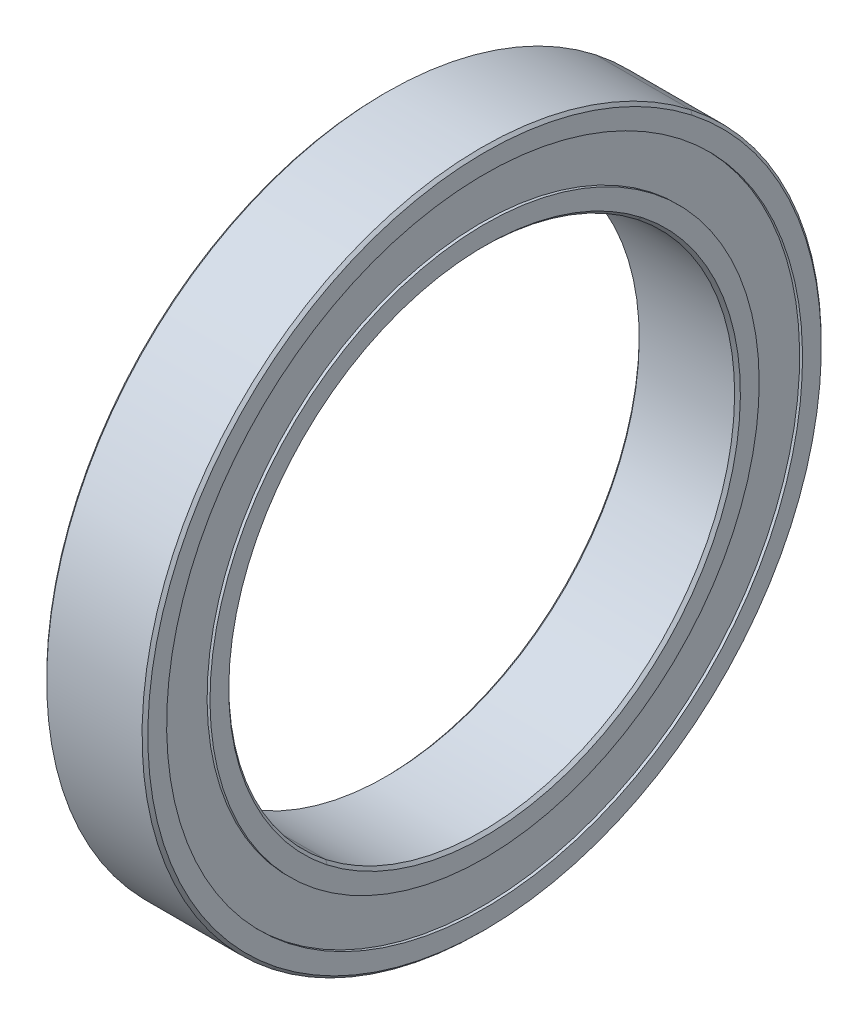
ISO-10303-21;
HEADER;
FILE_DESCRIPTION(('STEP AP214'),'2;1');
FILE_NAME('part.step','',(''),(''),'','','');
FILE_SCHEMA(('AUTOMOTIVE_DESIGN { 1 0 10303 214 1 1 1 1 }'));
ENDSEC;
DATA;
#1=APPLICATION_CONTEXT('core data for automotive mechanical design processes');
#2=APPLICATION_PROTOCOL_DEFINITION('international standard','automotive_design',2000,#1);
#3=PRODUCT_CONTEXT('',#1,'mechanical');
#4=PRODUCT('Part','Part','',(#3));
#5=PRODUCT_RELATED_PRODUCT_CATEGORY('part','',(#4));
#6=PRODUCT_DEFINITION_FORMATION('','',#4);
#7=PRODUCT_DEFINITION_CONTEXT('part definition',#1,'design');
#8=PRODUCT_DEFINITION('design','',#6,#7);
#9=PRODUCT_DEFINITION_SHAPE('','',#8);
#10=(LENGTH_UNIT() NAMED_UNIT(*) SI_UNIT(.MILLI.,.METRE.));
#11=(NAMED_UNIT(*) PLANE_ANGLE_UNIT() SI_UNIT($,.RADIAN.));
#12=(NAMED_UNIT(*) SI_UNIT($,.STERADIAN.) SOLID_ANGLE_UNIT());
#13=UNCERTAINTY_MEASURE_WITH_UNIT(LENGTH_MEASURE(1.E-05),#10,'distance_accuracy_value','');
#14=(GEOMETRIC_REPRESENTATION_CONTEXT(3) GLOBAL_UNCERTAINTY_ASSIGNED_CONTEXT((#13)) GLOBAL_UNIT_ASSIGNED_CONTEXT((#10,
#11,#12)) REPRESENTATION_CONTEXT('',''));
#15=CARTESIAN_POINT('',(0.,0.,0.));
#16=DIRECTION('',(0.,0.,1.));
#17=DIRECTION('',(1.,0.,0.));
#18=AXIS2_PLACEMENT_3D('',#15,#16,#17);
#19=CARTESIAN_POINT('',(85.025365407897,0.,20.5));
#20=DIRECTION('',(-1.,0.,0.));
#21=DIRECTION('',(0.,-0.787716900688965,0.616037405007985));
#22=AXIS2_PLACEMENT_3D('',#19,#20,#21);
#23=CONICAL_SURFACE('',#22,17.7,0.78539816339744);
#24=DIRECTION('',(-0.707106781186554,0.556999962132413,-0.435604226545706));
#25=VECTOR('',#24,1.);
#26=CARTESIAN_POINT('',(85.025365407897,13.9425891421947,9.59613793135867));
#27=LINE('',#26,#25);
#28=CARTESIAN_POINT('',(85.225365407897,13.7850457620569,9.71934541236027));
#29=VERTEX_POINT('',#28);
#30=CARTESIAN_POINT('',(85.025365407897,13.9425891421947,9.59613793135867));
#31=VERTEX_POINT('',#30);
#32=EDGE_CURVE('E302',#29,#31,#27,.T.);
#33=ORIENTED_EDGE('',*,*,#32,.F.);
#34=CARTESIAN_POINT('',(85.225365407897,0.,20.5));
#35=DIRECTION('',(-1.,0.,0.));
#36=DIRECTION('',(0.,0.787716900688965,-0.616037405007985));
#37=AXIS2_PLACEMENT_3D('',#34,#35,#36);
#38=CIRCLE('',#37,17.5);
#39=CARTESIAN_POINT('',(85.225365407897,-13.7850457620569,31.2806545876397));
#40=VERTEX_POINT('',#39);
#41=EDGE_CURVE('E174',#40,#29,#38,.T.);
#42=ORIENTED_EDGE('',*,*,#41,.F.);
#43=DIRECTION('',(-0.707106781186554,-0.556999962132413,0.435604226545706));
#44=VECTOR('',#43,1.);
#45=CARTESIAN_POINT('',(85.025365407897,-13.9425891421947,31.4038620686413));
#46=LINE('',#45,#44);
#47=CARTESIAN_POINT('',(85.025365407897,-13.9425891421947,31.4038620686413));
#48=VERTEX_POINT('',#47);
#49=EDGE_CURVE('E311',#40,#48,#46,.T.);
#50=ORIENTED_EDGE('',*,*,#49,.T.);
#51=CARTESIAN_POINT('',(85.025365407897,0.,20.5));
#52=DIRECTION('',(1.,0.,0.));
#53=DIRECTION('',(0.,0.787716900688965,-0.616037405007985));
#54=AXIS2_PLACEMENT_3D('',#51,#52,#53);
#55=CIRCLE('',#54,17.7);
#56=EDGE_CURVE('E221',#31,#48,#55,.T.);
#57=ORIENTED_EDGE('',*,*,#56,.F.);
#58=EDGE_LOOP('',(#33,#42,#50,#57));
#59=FACE_BOUND('',#58,.T.);
#60=ADVANCED_FACE('F50',(#59),#23,.F.);
#61=CARTESIAN_POINT('',(91.825365407897,0.,20.5));
#62=DIRECTION('',(1.,0.,0.));
#63=DIRECTION('',(0.,0.787716900688965,-0.616037405007985));
#64=AXIS2_PLACEMENT_3D('',#61,#62,#63);
#65=CONICAL_SURFACE('',#64,17.5,0.785398163397457);
#66=DIRECTION('',(0.707106781186542,-0.556999962132422,0.435604226545714));
#67=VECTOR('',#66,1.);
#68=CARTESIAN_POINT('',(91.825365407897,-13.7850457620569,31.2806545876397));
#69=LINE('',#68,#67);
#70=CARTESIAN_POINT('',(91.825365407897,-13.7850457620569,31.2806545876397));
#71=VERTEX_POINT('',#70);
#72=CARTESIAN_POINT('',(92.025365407897,-13.9425891421947,31.4038620686413));
#73=VERTEX_POINT('',#72);
#74=EDGE_CURVE('E310',#71,#73,#69,.T.);
#75=ORIENTED_EDGE('',*,*,#74,.F.);
#76=CARTESIAN_POINT('',(91.825365407897,0.,20.5));
#77=DIRECTION('',(1.,0.,0.));
#78=DIRECTION('',(0.,0.787716900688965,-0.616037405007985));
#79=AXIS2_PLACEMENT_3D('',#76,#77,#78);
#80=CIRCLE('',#79,17.5);
#81=CARTESIAN_POINT('',(91.825365407897,13.7850457620569,9.71934541236027));
#82=VERTEX_POINT('',#81);
#83=EDGE_CURVE('E242',#82,#71,#80,.T.);
#84=ORIENTED_EDGE('',*,*,#83,.F.);
#85=DIRECTION('',(0.707106781186542,0.556999962132422,-0.435604226545714));
#86=VECTOR('',#85,1.);
#87=CARTESIAN_POINT('',(91.825365407897,13.7850457620569,9.71934541236027));
#88=LINE('',#87,#86);
#89=CARTESIAN_POINT('',(92.025365407897,13.9425891421947,9.59613793135867));
#90=VERTEX_POINT('',#89);
#91=EDGE_CURVE('E327',#82,#90,#88,.T.);
#92=ORIENTED_EDGE('',*,*,#91,.T.);
#93=CARTESIAN_POINT('',(92.025365407897,0.,20.5));
#94=DIRECTION('',(-1.,0.,0.));
#95=DIRECTION('',(0.,0.787716900688965,-0.616037405007985));
#96=AXIS2_PLACEMENT_3D('',#93,#94,#95);
#97=CIRCLE('',#96,17.7);
#98=EDGE_CURVE('E228',#73,#90,#97,.T.);
#99=ORIENTED_EDGE('',*,*,#98,.F.);
#100=EDGE_LOOP('',(#75,#84,#92,#99));
#101=FACE_BOUND('',#100,.T.);
#102=ADVANCED_FACE('F402',(#101),#65,.F.);
#103=CARTESIAN_POINT('',(85.225365407897,0.,20.5));
#104=DIRECTION('',(1.,0.,0.));
#105=DIRECTION('',(0.,0.787716900688965,-0.616037405007985));
#106=AXIS2_PLACEMENT_3D('',#103,#104,#105);
#107=CONICAL_SURFACE('',#106,23.5,0.785398163397448);
#108=DIRECTION('',(0.707106781186548,-0.556999962132418,0.43560422654571));
#109=VECTOR('',#108,1.);
#110=CARTESIAN_POINT('',(85.225365407897,-18.5113471661907,34.9768790176876));
#111=LINE('',#110,#109);
#112=CARTESIAN_POINT('',(85.025365407897,-18.3538037860529,34.853671536686));
#113=VERTEX_POINT('',#112);
#114=CARTESIAN_POINT('',(85.225365407897,-18.5113471661907,34.9768790176876));
#115=VERTEX_POINT('',#114);
#116=EDGE_CURVE('E326',#113,#115,#111,.T.);
#117=ORIENTED_EDGE('',*,*,#116,.F.);
#118=CARTESIAN_POINT('',(85.025365407897,0.,20.5));
#119=DIRECTION('',(-1.,0.,0.));
#120=DIRECTION('',(0.,0.787716900688965,-0.616037405007985));
#121=AXIS2_PLACEMENT_3D('',#118,#119,#120);
#122=CIRCLE('',#121,23.3);
#123=CARTESIAN_POINT('',(85.025365407897,18.3538037860529,6.14632846331395));
#124=VERTEX_POINT('',#123);
#125=EDGE_CURVE('E238',#124,#113,#122,.T.);
#126=ORIENTED_EDGE('',*,*,#125,.F.);
#127=DIRECTION('',(0.707106781186548,0.556999962132418,-0.43560422654571));
#128=VECTOR('',#127,1.);
#129=CARTESIAN_POINT('',(85.225365407897,18.5113471661907,6.02312098231236));
#130=LINE('',#129,#128);
#131=CARTESIAN_POINT('',(85.225365407897,18.5113471661907,6.02312098231236));
#132=VERTEX_POINT('',#131);
#133=EDGE_CURVE('E348',#124,#132,#130,.T.);
#134=ORIENTED_EDGE('',*,*,#133,.T.);
#135=CARTESIAN_POINT('',(85.225365407897,0.,20.5));
#136=DIRECTION('',(1.,0.,0.));
#137=DIRECTION('',(0.,0.787716900688965,-0.616037405007985));
#138=AXIS2_PLACEMENT_3D('',#135,#136,#137);
#139=CIRCLE('',#138,23.5);
#140=EDGE_CURVE('E241',#115,#132,#139,.T.);
#141=ORIENTED_EDGE('',*,*,#140,.F.);
#142=EDGE_LOOP('',(#117,#126,#134,#141));
#143=FACE_BOUND('',#142,.T.);
#144=ADVANCED_FACE('F407',(#143),#107,.T.);
#145=CARTESIAN_POINT('',(92.025365407897,0.,20.5));
#146=DIRECTION('',(-1.,0.,0.));
#147=DIRECTION('',(0.,-0.787716900688965,0.616037405007985));
#148=AXIS2_PLACEMENT_3D('',#145,#146,#147);
#149=CONICAL_SURFACE('',#148,23.3,0.785398163397431);
#150=DIRECTION('',(-0.70710678118656,0.556999962132407,-0.435604226545702));
#151=VECTOR('',#150,1.);
#152=CARTESIAN_POINT('',(92.025365407897,18.3538037860529,6.14632846331396));
#153=LINE('',#152,#151);
#154=CARTESIAN_POINT('',(92.025365407897,18.3538037860529,6.14632846331396));
#155=VERTEX_POINT('',#154);
#156=CARTESIAN_POINT('',(91.825365407897,18.5113471661907,6.02312098231236));
#157=VERTEX_POINT('',#156);
#158=EDGE_CURVE('E335',#155,#157,#153,.T.);
#159=ORIENTED_EDGE('',*,*,#158,.F.);
#160=CARTESIAN_POINT('',(92.025365407897,0.,20.5));
#161=DIRECTION('',(1.,0.,0.));
#162=DIRECTION('',(0.,0.787716900688965,-0.616037405007985));
#163=AXIS2_PLACEMENT_3D('',#160,#161,#162);
#164=CIRCLE('',#163,23.3);
#165=CARTESIAN_POINT('',(92.025365407897,-18.3538037860529,34.853671536686));
#166=VERTEX_POINT('',#165);
#167=EDGE_CURVE('E229',#166,#155,#164,.T.);
#168=ORIENTED_EDGE('',*,*,#167,.F.);
#169=DIRECTION('',(-0.70710678118656,-0.556999962132407,0.435604226545702));
#170=VECTOR('',#169,1.);
#171=CARTESIAN_POINT('',(92.025365407897,-18.3538037860529,34.853671536686));
#172=LINE('',#171,#170);
#173=CARTESIAN_POINT('',(91.825365407897,-18.5113471661907,34.9768790176876));
#174=VERTEX_POINT('',#173);
#175=EDGE_CURVE('E364',#166,#174,#172,.T.);
#176=ORIENTED_EDGE('',*,*,#175,.T.);
#177=CARTESIAN_POINT('',(91.825365407897,0.,20.5));
#178=DIRECTION('',(-1.,0.,0.));
#179=DIRECTION('',(0.,0.787716900688965,-0.616037405007985));
#180=AXIS2_PLACEMENT_3D('',#177,#178,#179);
#181=CIRCLE('',#180,23.5);
#182=EDGE_CURVE('E237',#157,#174,#181,.T.);
#183=ORIENTED_EDGE('',*,*,#182,.F.);
#184=EDGE_LOOP('',(#159,#168,#176,#183));
#185=FACE_BOUND('',#184,.T.);
#186=ADVANCED_FACE('F399',(#185),#149,.T.);
#187=CARTESIAN_POINT('',(85.225365407897,0.,20.5));
#188=DIRECTION('',(-1.,0.,0.));
#189=DIRECTION('',(0.,-0.787716900688965,0.616037405007985));
#190=AXIS2_PLACEMENT_3D('',#187,#188,#189);
#191=CYLINDRICAL_SURFACE('',#190,19.);
#192=DIRECTION('',(-1.,0.,0.));
#193=VECTOR('',#192,1.);
#194=CARTESIAN_POINT('',(85.225365407897,14.9666211130903,8.79528930484829));
#195=LINE('',#194,#193);
#196=CARTESIAN_POINT('',(85.225365407897,14.9666211130903,8.79528930484829));
#197=VERTEX_POINT('',#196);
#198=CARTESIAN_POINT('',(85.025365407897,14.9666211130903,8.79528930484829));
#199=VERTEX_POINT('',#198);
#200=EDGE_CURVE('E372',#197,#199,#195,.T.);
#201=ORIENTED_EDGE('',*,*,#200,.F.);
#202=CARTESIAN_POINT('',(85.225365407897,0.,20.5));
#203=DIRECTION('',(-1.,0.,0.));
#204=DIRECTION('',(0.,-0.787716900688965,0.616037405007985));
#205=AXIS2_PLACEMENT_3D('',#202,#203,#204);
#206=CIRCLE('',#205,19.);
#207=CARTESIAN_POINT('',(85.225365407897,-14.9666211130903,32.2047106951517));
#208=VERTEX_POINT('',#207);
#209=EDGE_CURVE('E11',#197,#208,#206,.T.);
#210=ORIENTED_EDGE('',*,*,#209,.T.);
#211=DIRECTION('',(-1.,0.,0.));
#212=VECTOR('',#211,1.);
#213=CARTESIAN_POINT('',(85.225365407897,-14.9666211130903,32.2047106951517));
#214=LINE('',#213,#212);
#215=CARTESIAN_POINT('',(85.025365407897,-14.9666211130903,32.2047106951517));
#216=VERTEX_POINT('',#215);
#217=EDGE_CURVE('E269',#208,#216,#214,.T.);
#218=ORIENTED_EDGE('',*,*,#217,.T.);
#219=CARTESIAN_POINT('',(85.025365407897,0.,20.5));
#220=DIRECTION('',(-1.,0.,0.));
#221=DIRECTION('',(0.,-0.787716900688965,0.616037405007985));
#222=AXIS2_PLACEMENT_3D('',#219,#220,#221);
#223=CIRCLE('',#222,19.);
#224=EDGE_CURVE('E218',#199,#216,#223,.T.);
#225=ORIENTED_EDGE('',*,*,#224,.F.);
#226=EDGE_LOOP('',(#201,#210,#218,#225));
#227=FACE_BOUND('',#226,.T.);
#228=ADVANCED_FACE('F389',(#227),#191,.T.);
#229=CARTESIAN_POINT('',(85.225365407897,0.,20.5));
#230=DIRECTION('',(-1.,0.,0.));
#231=DIRECTION('',(0.,-0.787716900688965,0.616037405007985));
#232=AXIS2_PLACEMENT_3D('',#229,#230,#231);
#233=PLANE('',#232);
#234=CARTESIAN_POINT('',(85.225365407897,0.,20.5));
#235=DIRECTION('',(-1.,0.,0.));
#236=DIRECTION('',(0.,-0.787716900688965,0.616037405007985));
#237=AXIS2_PLACEMENT_3D('',#234,#235,#236);
#238=CIRCLE('',#237,19.);
#239=EDGE_CURVE('E368',#208,#197,#238,.T.);
#240=ORIENTED_EDGE('',*,*,#239,.F.);
#241=ORIENTED_EDGE('',*,*,#209,.F.);
#242=EDGE_LOOP('',(#240,#241));
#243=FACE_BOUND('',#242,.T.);
#244=CARTESIAN_POINT('',(85.225365407897,0.,20.5));
#245=DIRECTION('',(-1.,0.,0.));
#246=DIRECTION('',(0.,-0.787716900688965,0.616037405007985));
#247=AXIS2_PLACEMENT_3D('',#244,#245,#246);
#248=CIRCLE('',#247,22.);
#249=CARTESIAN_POINT('',(85.225365407897,-17.3297718151572,34.0528229101757));
#250=VERTEX_POINT('',#249);
#251=CARTESIAN_POINT('',(85.225365407897,17.3297718151572,6.94717708982434));
#252=VERTEX_POINT('',#251);
#253=EDGE_CURVE('E58',#250,#252,#248,.T.);
#254=ORIENTED_EDGE('',*,*,#253,.T.);
#255=CARTESIAN_POINT('',(85.225365407897,0.,20.5));
#256=DIRECTION('',(-1.,0.,0.));
#257=DIRECTION('',(0.,-0.787716900688965,0.616037405007985));
#258=AXIS2_PLACEMENT_3D('',#255,#256,#257);
#259=CIRCLE('',#258,22.);
#260=EDGE_CURVE('E253',#252,#250,#259,.T.);
#261=ORIENTED_EDGE('',*,*,#260,.T.);
#262=EDGE_LOOP('',(#254,#261));
#263=FACE_BOUND('',#262,.T.);
#264=ADVANCED_FACE('F251',(#243,#263),#233,.T.);
#265=CARTESIAN_POINT('',(85.225365407897,0.,20.5));
#266=DIRECTION('',(-1.,0.,0.));
#267=DIRECTION('',(0.,-0.787716900688965,0.616037405007985));
#268=AXIS2_PLACEMENT_3D('',#265,#266,#267);
#269=CYLINDRICAL_SURFACE('',#268,22.);
#270=DIRECTION('',(-1.,0.,0.));
#271=VECTOR('',#270,1.);
#272=CARTESIAN_POINT('',(85.225365407897,17.3297718151572,6.94717708982434));
#273=LINE('',#272,#271);
#274=CARTESIAN_POINT('',(85.025365407897,17.3297718151572,6.94717708982434));
#275=VERTEX_POINT('',#274);
#276=EDGE_CURVE('E258',#252,#275,#273,.T.);
#277=ORIENTED_EDGE('',*,*,#276,.F.);
#278=ORIENTED_EDGE('',*,*,#253,.F.);
#279=DIRECTION('',(-1.,0.,0.));
#280=VECTOR('',#279,1.);
#281=CARTESIAN_POINT('',(85.225365407897,-17.3297718151572,34.0528229101757));
#282=LINE('',#281,#280);
#283=CARTESIAN_POINT('',(85.025365407897,-17.3297718151572,34.0528229101757));
#284=VERTEX_POINT('',#283);
#285=EDGE_CURVE('E267',#250,#284,#282,.T.);
#286=ORIENTED_EDGE('',*,*,#285,.T.);
#287=CARTESIAN_POINT('',(85.025365407897,0.,20.5));
#288=DIRECTION('',(-1.,0.,0.));
#289=DIRECTION('',(0.,-0.787716900688965,0.616037405007985));
#290=AXIS2_PLACEMENT_3D('',#287,#288,#289);
#291=CIRCLE('',#290,22.);
#292=EDGE_CURVE('E233',#284,#275,#291,.T.);
#293=ORIENTED_EDGE('',*,*,#292,.T.);
#294=EDGE_LOOP('',(#277,#278,#286,#293));
#295=FACE_BOUND('',#294,.T.);
#296=ADVANCED_FACE('F259',(#295),#269,.F.);
#297=CARTESIAN_POINT('',(91.825365407897,0.,20.5));
#298=DIRECTION('',(1.,0.,0.));
#299=DIRECTION('',(0.,0.787716900688965,-0.616037405007985));
#300=AXIS2_PLACEMENT_3D('',#297,#298,#299);
#301=CYLINDRICAL_SURFACE('',#300,19.);
#302=DIRECTION('',(1.,0.,0.));
#303=VECTOR('',#302,1.);
#304=CARTESIAN_POINT('',(91.825365407897,-14.9666211130903,32.2047106951517));
#305=LINE('',#304,#303);
#306=CARTESIAN_POINT('',(91.825365407897,-14.9666211130903,32.2047106951517));
#307=VERTEX_POINT('',#306);
#308=CARTESIAN_POINT('',(92.025365407897,-14.9666211130903,32.2047106951517));
#309=VERTEX_POINT('',#308);
#310=EDGE_CURVE('E284',#307,#309,#305,.T.);
#311=ORIENTED_EDGE('',*,*,#310,.F.);
#312=CARTESIAN_POINT('',(91.825365407897,0.,20.5));
#313=DIRECTION('',(1.,0.,0.));
#314=DIRECTION('',(0.,0.787716900688965,-0.616037405007985));
#315=AXIS2_PLACEMENT_3D('',#312,#313,#314);
#316=CIRCLE('',#315,19.);
#317=CARTESIAN_POINT('',(91.825365407897,14.9666211130903,8.79528930484829));
#318=VERTEX_POINT('',#317);
#319=EDGE_CURVE('E173',#307,#318,#316,.T.);
#320=ORIENTED_EDGE('',*,*,#319,.T.);
#321=DIRECTION('',(1.,0.,0.));
#322=VECTOR('',#321,1.);
#323=CARTESIAN_POINT('',(91.825365407897,14.9666211130903,8.79528930484829));
#324=LINE('',#323,#322);
#325=CARTESIAN_POINT('',(92.025365407897,14.9666211130903,8.79528930484829));
#326=VERTEX_POINT('',#325);
#327=EDGE_CURVE('E187',#318,#326,#324,.T.);
#328=ORIENTED_EDGE('',*,*,#327,.T.);
#329=CARTESIAN_POINT('',(92.025365407897,0.,20.5));
#330=DIRECTION('',(1.,0.,0.));
#331=DIRECTION('',(0.,0.787716900688965,-0.616037405007985));
#332=AXIS2_PLACEMENT_3D('',#329,#330,#331);
#333=CIRCLE('',#332,19.);
#334=EDGE_CURVE('E225',#309,#326,#333,.T.);
#335=ORIENTED_EDGE('',*,*,#334,.F.);
#336=EDGE_LOOP('',(#311,#320,#328,#335));
#337=FACE_BOUND('',#336,.T.);
#338=ADVANCED_FACE('F397',(#337),#301,.T.);
#339=CARTESIAN_POINT('',(91.825365407897,0.,20.5));
#340=DIRECTION('',(1.,0.,0.));
#341=DIRECTION('',(0.,0.616037405007985,0.787716900688965));
#342=AXIS2_PLACEMENT_3D('',#339,#340,#341);
#343=PLANE('',#342);
#344=CARTESIAN_POINT('',(91.825365407897,0.,20.5));
#345=DIRECTION('',(1.,0.,0.));
#346=DIRECTION('',(0.,0.787716900688965,-0.616037405007985));
#347=AXIS2_PLACEMENT_3D('',#344,#345,#346);
#348=CIRCLE('',#347,19.);
#349=EDGE_CURVE('E281',#318,#307,#348,.T.);
#350=ORIENTED_EDGE('',*,*,#349,.F.);
#351=ORIENTED_EDGE('',*,*,#319,.F.);
#352=EDGE_LOOP('',(#350,#351));
#353=FACE_BOUND('',#352,.T.);
#354=CARTESIAN_POINT('',(91.825365407897,0.,20.5));
#355=DIRECTION('',(1.,0.,0.));
#356=DIRECTION('',(0.,0.787716900688965,-0.616037405007985));
#357=AXIS2_PLACEMENT_3D('',#354,#355,#356);
#358=CIRCLE('',#357,22.);
#359=CARTESIAN_POINT('',(91.825365407897,17.3297718151572,6.94717708982434));
#360=VERTEX_POINT('',#359);
#361=CARTESIAN_POINT('',(91.825365407897,-17.3297718151572,34.0528229101757));
#362=VERTEX_POINT('',#361);
#363=EDGE_CURVE('E167',#360,#362,#358,.T.);
#364=ORIENTED_EDGE('',*,*,#363,.T.);
#365=CARTESIAN_POINT('',(91.825365407897,0.,20.5));
#366=DIRECTION('',(1.,0.,0.));
#367=DIRECTION('',(0.,0.787716900688965,-0.616037405007985));
#368=AXIS2_PLACEMENT_3D('',#365,#366,#367);
#369=CIRCLE('',#368,22.);
#370=EDGE_CURVE('E170',#362,#360,#369,.T.);
#371=ORIENTED_EDGE('',*,*,#370,.T.);
#372=EDGE_LOOP('',(#364,#371));
#373=FACE_BOUND('',#372,.T.);
#374=ADVANCED_FACE('F168',(#353,#373),#343,.T.);
#375=CARTESIAN_POINT('',(91.825365407897,0.,20.5));
#376=DIRECTION('',(1.,0.,0.));
#377=DIRECTION('',(0.,0.787716900688965,-0.616037405007985));
#378=AXIS2_PLACEMENT_3D('',#375,#376,#377);
#379=CYLINDRICAL_SURFACE('',#378,22.);
#380=DIRECTION('',(1.,0.,0.));
#381=VECTOR('',#380,1.);
#382=CARTESIAN_POINT('',(91.825365407897,-17.3297718151572,34.0528229101757));
#383=LINE('',#382,#381);
#384=CARTESIAN_POINT('',(92.025365407897,-17.3297718151572,34.0528229101757));
#385=VERTEX_POINT('',#384);
#386=EDGE_CURVE('E177',#362,#385,#383,.T.);
#387=ORIENTED_EDGE('',*,*,#386,.F.);
#388=ORIENTED_EDGE('',*,*,#363,.F.);
#389=DIRECTION('',(1.,0.,0.));
#390=VECTOR('',#389,1.);
#391=CARTESIAN_POINT('',(91.825365407897,17.3297718151572,6.94717708982434));
#392=LINE('',#391,#390);
#393=CARTESIAN_POINT('',(92.025365407897,17.3297718151572,6.94717708982434));
#394=VERTEX_POINT('',#393);
#395=EDGE_CURVE('E185',#360,#394,#392,.T.);
#396=ORIENTED_EDGE('',*,*,#395,.T.);
#397=CARTESIAN_POINT('',(92.025365407897,0.,20.5));
#398=DIRECTION('',(1.,0.,0.));
#399=DIRECTION('',(0.,0.787716900688965,-0.616037405007985));
#400=AXIS2_PLACEMENT_3D('',#397,#398,#399);
#401=CIRCLE('',#400,22.);
#402=EDGE_CURVE('E67',#394,#385,#401,.T.);
#403=ORIENTED_EDGE('',*,*,#402,.T.);
#404=EDGE_LOOP('',(#387,#388,#396,#403));
#405=FACE_BOUND('',#404,.T.);
#406=ADVANCED_FACE('F178',(#405),#379,.F.);
#407=CARTESIAN_POINT('',(92.025365407897,0.,20.5));
#408=DIRECTION('',(-1.,0.,0.));
#409=DIRECTION('',(0.,-0.787716900688965,0.616037405007985));
#410=AXIS2_PLACEMENT_3D('',#407,#408,#409);
#411=CYLINDRICAL_SURFACE('',#410,17.5);
#412=DIRECTION('',(-1.,0.,0.));
#413=VECTOR('',#412,1.);
#414=CARTESIAN_POINT('',(92.025365407897,13.7850457620569,9.71934541236027));
#415=LINE('',#414,#413);
#416=EDGE_CURVE('E202',#82,#29,#415,.T.);
#417=ORIENTED_EDGE('',*,*,#416,.F.);
#418=ORIENTED_EDGE('',*,*,#83,.T.);
#419=DIRECTION('',(-1.,0.,0.));
#420=VECTOR('',#419,1.);
#421=CARTESIAN_POINT('',(92.025365407897,-13.7850457620569,31.2806545876397));
#422=LINE('',#421,#420);
#423=EDGE_CURVE('E206',#71,#40,#422,.T.);
#424=ORIENTED_EDGE('',*,*,#423,.T.);
#425=ORIENTED_EDGE('',*,*,#41,.T.);
#426=EDGE_LOOP('',(#417,#418,#424,#425));
#427=FACE_BOUND('',#426,.T.);
#428=ADVANCED_FACE('F444',(#427),#411,.F.);
#429=CARTESIAN_POINT('',(92.025365407897,0.,20.5));
#430=DIRECTION('',(-1.,0.,0.));
#431=DIRECTION('',(0.,-0.787716900688965,0.616037405007985));
#432=AXIS2_PLACEMENT_3D('',#429,#430,#431);
#433=CYLINDRICAL_SURFACE('',#432,23.5);
#434=DIRECTION('',(-1.,0.,0.));
#435=VECTOR('',#434,1.);
#436=CARTESIAN_POINT('',(92.025365407897,18.5113471661907,6.02312098231236));
#437=LINE('',#436,#435);
#438=EDGE_CURVE('E210',#157,#132,#437,.T.);
#439=ORIENTED_EDGE('',*,*,#438,.F.);
#440=ORIENTED_EDGE('',*,*,#182,.T.);
#441=DIRECTION('',(-1.,0.,0.));
#442=VECTOR('',#441,1.);
#443=CARTESIAN_POINT('',(92.025365407897,-18.5113471661907,34.9768790176876));
#444=LINE('',#443,#442);
#445=EDGE_CURVE('E214',#174,#115,#444,.T.);
#446=ORIENTED_EDGE('',*,*,#445,.T.);
#447=ORIENTED_EDGE('',*,*,#140,.T.);
#448=EDGE_LOOP('',(#439,#440,#446,#447));
#449=FACE_BOUND('',#448,.T.);
#450=ADVANCED_FACE('F474',(#449),#433,.T.);
#451=CARTESIAN_POINT('',(85.025365407897,0.,20.5));
#452=DIRECTION('',(1.,0.,0.));
#453=DIRECTION('',(0.,0.616037405007985,0.787716900688965));
#454=AXIS2_PLACEMENT_3D('',#451,#452,#453);
#455=PLANE('',#454);
#456=ORIENTED_EDGE('',*,*,#292,.F.);
#457=CARTESIAN_POINT('',(85.025365407897,0.,20.5));
#458=DIRECTION('',(-1.,0.,0.));
#459=DIRECTION('',(0.,-0.787716900688965,0.616037405007985));
#460=AXIS2_PLACEMENT_3D('',#457,#458,#459);
#461=CIRCLE('',#460,22.);
#462=EDGE_CURVE('E264',#275,#284,#461,.T.);
#463=ORIENTED_EDGE('',*,*,#462,.F.);
#464=EDGE_LOOP('',(#456,#463));
#465=FACE_BOUND('',#464,.T.);
#466=ORIENTED_EDGE('',*,*,#125,.T.);
#467=CARTESIAN_POINT('',(85.025365407897,0.,20.5));
#468=DIRECTION('',(-1.,0.,0.));
#469=DIRECTION('',(0.,0.787716900688965,-0.616037405007985));
#470=AXIS2_PLACEMENT_3D('',#467,#468,#469);
#471=CIRCLE('',#470,23.3);
#472=EDGE_CURVE('E322',#113,#124,#471,.T.);
#473=ORIENTED_EDGE('',*,*,#472,.T.);
#474=EDGE_LOOP('',(#466,#473));
#475=FACE_BOUND('',#474,.T.);
#476=ADVANCED_FACE('F478',(#465,#475),#455,.F.);
#477=CARTESIAN_POINT('',(92.025365407897,0.,20.5));
#478=DIRECTION('',(1.,0.,0.));
#479=DIRECTION('',(0.,0.616037405007985,0.787716900688965));
#480=AXIS2_PLACEMENT_3D('',#477,#478,#479);
#481=PLANE('',#480);
#482=ORIENTED_EDGE('',*,*,#402,.F.);
#483=CARTESIAN_POINT('',(92.025365407897,0.,20.5));
#484=DIRECTION('',(1.,0.,0.));
#485=DIRECTION('',(0.,0.787716900688965,-0.616037405007985));
#486=AXIS2_PLACEMENT_3D('',#483,#484,#485);
#487=CIRCLE('',#486,22.);
#488=EDGE_CURVE('E182',#385,#394,#487,.T.);
#489=ORIENTED_EDGE('',*,*,#488,.F.);
#490=EDGE_LOOP('',(#482,#489));
#491=FACE_BOUND('',#490,.T.);
#492=ORIENTED_EDGE('',*,*,#167,.T.);
#493=CARTESIAN_POINT('',(92.025365407897,0.,20.5));
#494=DIRECTION('',(1.,0.,0.));
#495=DIRECTION('',(0.,0.787716900688965,-0.616037405007985));
#496=AXIS2_PLACEMENT_3D('',#493,#494,#495);
#497=CIRCLE('',#496,23.3);
#498=EDGE_CURVE('E340',#155,#166,#497,.T.);
#499=ORIENTED_EDGE('',*,*,#498,.T.);
#500=EDGE_LOOP('',(#492,#499));
#501=FACE_BOUND('',#500,.T.);
#502=ADVANCED_FACE('F468',(#491,#501),#481,.T.);
#503=CARTESIAN_POINT('',(92.025365407897,0.,20.5));
#504=DIRECTION('',(1.,0.,0.));
#505=DIRECTION('',(0.,0.616037405007985,0.787716900688965));
#506=AXIS2_PLACEMENT_3D('',#503,#504,#505);
#507=PLANE('',#506);
#508=CARTESIAN_POINT('',(92.025365407897,0.,20.5));
#509=DIRECTION('',(-1.,0.,0.));
#510=DIRECTION('',(0.,0.787716900688965,-0.616037405007985));
#511=AXIS2_PLACEMENT_3D('',#508,#509,#510);
#512=CIRCLE('',#511,17.7);
#513=EDGE_CURVE('E321',#90,#73,#512,.T.);
#514=ORIENTED_EDGE('',*,*,#513,.T.);
#515=ORIENTED_EDGE('',*,*,#98,.T.);
#516=EDGE_LOOP('',(#514,#515));
#517=FACE_BOUND('',#516,.T.);
#518=CARTESIAN_POINT('',(92.025365407897,0.,20.5));
#519=DIRECTION('',(1.,0.,0.));
#520=DIRECTION('',(0.,0.787716900688965,-0.616037405007985));
#521=AXIS2_PLACEMENT_3D('',#518,#519,#520);
#522=CIRCLE('',#521,19.);
#523=EDGE_CURVE('E193',#326,#309,#522,.T.);
#524=ORIENTED_EDGE('',*,*,#523,.T.);
#525=ORIENTED_EDGE('',*,*,#334,.T.);
#526=EDGE_LOOP('',(#524,#525));
#527=FACE_BOUND('',#526,.T.);
#528=ADVANCED_FACE('F431',(#517,#527),#507,.T.);
#529=CARTESIAN_POINT('',(85.025365407897,0.,20.5));
#530=DIRECTION('',(1.,0.,0.));
#531=DIRECTION('',(0.,0.616037405007985,0.787716900688965));
#532=AXIS2_PLACEMENT_3D('',#529,#530,#531);
#533=PLANE('',#532);
#534=CARTESIAN_POINT('',(85.025365407897,0.,20.5));
#535=DIRECTION('',(1.,0.,0.));
#536=DIRECTION('',(0.,0.787716900688965,-0.616037405007985));
#537=AXIS2_PLACEMENT_3D('',#534,#535,#536);
#538=CIRCLE('',#537,17.7);
#539=EDGE_CURVE('E304',#48,#31,#538,.T.);
#540=ORIENTED_EDGE('',*,*,#539,.T.);
#541=ORIENTED_EDGE('',*,*,#56,.T.);
#542=EDGE_LOOP('',(#540,#541));
#543=FACE_BOUND('',#542,.T.);
#544=CARTESIAN_POINT('',(85.025365407897,0.,20.5));
#545=DIRECTION('',(-1.,0.,0.));
#546=DIRECTION('',(0.,-0.787716900688965,0.616037405007985));
#547=AXIS2_PLACEMENT_3D('',#544,#545,#546);
#548=CIRCLE('',#547,19.);
#549=EDGE_CURVE('E274',#216,#199,#548,.T.);
#550=ORIENTED_EDGE('',*,*,#549,.T.);
#551=ORIENTED_EDGE('',*,*,#224,.T.);
#552=EDGE_LOOP('',(#550,#551));
#553=FACE_BOUND('',#552,.T.);
#554=ADVANCED_FACE('F382',(#543,#553),#533,.F.);
#555=CARTESIAN_POINT('',(92.025365407897,0.,20.5));
#556=DIRECTION('',(-1.,0.,0.));
#557=DIRECTION('',(0.,-0.787716900688965,0.616037405007985));
#558=AXIS2_PLACEMENT_3D('',#555,#556,#557);
#559=CYLINDRICAL_SURFACE('',#558,23.5);
#560=CARTESIAN_POINT('',(91.825365407897,0.,20.5));
#561=DIRECTION('',(-1.,0.,0.));
#562=DIRECTION('',(0.,0.787716900688965,-0.616037405007985));
#563=AXIS2_PLACEMENT_3D('',#560,#561,#562);
#564=CIRCLE('',#563,23.5);
#565=EDGE_CURVE('E339',#174,#157,#564,.T.);
#566=ORIENTED_EDGE('',*,*,#565,.T.);
#567=ORIENTED_EDGE('',*,*,#438,.T.);
#568=CARTESIAN_POINT('',(85.225365407897,0.,20.5));
#569=DIRECTION('',(1.,0.,0.));
#570=DIRECTION('',(0.,0.787716900688965,-0.616037405007985));
#571=AXIS2_PLACEMENT_3D('',#568,#569,#570);
#572=CIRCLE('',#571,23.5);
#573=EDGE_CURVE('E347',#132,#115,#572,.T.);
#574=ORIENTED_EDGE('',*,*,#573,.T.);
#575=ORIENTED_EDGE('',*,*,#445,.F.);
#576=EDGE_LOOP('',(#566,#567,#574,#575));
#577=FACE_BOUND('',#576,.T.);
#578=ADVANCED_FACE('F460',(#577),#559,.T.);
#579=CARTESIAN_POINT('',(92.025365407897,0.,20.5));
#580=DIRECTION('',(-1.,0.,0.));
#581=DIRECTION('',(0.,-0.787716900688965,0.616037405007985));
#582=AXIS2_PLACEMENT_3D('',#579,#580,#581);
#583=CYLINDRICAL_SURFACE('',#582,17.5);
#584=CARTESIAN_POINT('',(91.825365407897,0.,20.5));
#585=DIRECTION('',(1.,0.,0.));
#586=DIRECTION('',(0.,0.787716900688965,-0.616037405007985));
#587=AXIS2_PLACEMENT_3D('',#584,#585,#586);
#588=CIRCLE('',#587,17.5);
#589=EDGE_CURVE('E306',#71,#82,#588,.T.);
#590=ORIENTED_EDGE('',*,*,#589,.T.);
#591=ORIENTED_EDGE('',*,*,#416,.T.);
#592=CARTESIAN_POINT('',(85.225365407897,0.,20.5));
#593=DIRECTION('',(-1.,0.,0.));
#594=DIRECTION('',(0.,0.787716900688965,-0.616037405007985));
#595=AXIS2_PLACEMENT_3D('',#592,#593,#594);
#596=CIRCLE('',#595,17.5);
#597=EDGE_CURVE('E300',#29,#40,#596,.T.);
#598=ORIENTED_EDGE('',*,*,#597,.T.);
#599=ORIENTED_EDGE('',*,*,#423,.F.);
#600=EDGE_LOOP('',(#590,#591,#598,#599));
#601=FACE_BOUND('',#600,.T.);
#602=ADVANCED_FACE('F442',(#601),#583,.F.);
#603=CARTESIAN_POINT('',(91.825365407897,0.,20.5));
#604=DIRECTION('',(1.,0.,0.));
#605=DIRECTION('',(0.,0.787716900688965,-0.616037405007985));
#606=AXIS2_PLACEMENT_3D('',#603,#604,#605);
#607=CYLINDRICAL_SURFACE('',#606,22.);
#608=ORIENTED_EDGE('',*,*,#370,.F.);
#609=ORIENTED_EDGE('',*,*,#386,.T.);
#610=ORIENTED_EDGE('',*,*,#488,.T.);
#611=ORIENTED_EDGE('',*,*,#395,.F.);
#612=EDGE_LOOP('',(#608,#609,#610,#611));
#613=FACE_BOUND('',#612,.T.);
#614=ADVANCED_FACE('F184',(#613),#607,.F.);
#615=CARTESIAN_POINT('',(91.825365407897,0.,20.5));
#616=DIRECTION('',(1.,0.,0.));
#617=DIRECTION('',(0.,0.787716900688965,-0.616037405007985));
#618=AXIS2_PLACEMENT_3D('',#615,#616,#617);
#619=CYLINDRICAL_SURFACE('',#618,19.);
#620=ORIENTED_EDGE('',*,*,#349,.T.);
#621=ORIENTED_EDGE('',*,*,#310,.T.);
#622=ORIENTED_EDGE('',*,*,#523,.F.);
#623=ORIENTED_EDGE('',*,*,#327,.F.);
#624=EDGE_LOOP('',(#620,#621,#622,#623));
#625=FACE_BOUND('',#624,.T.);
#626=ADVANCED_FACE('F494',(#625),#619,.T.);
#627=CARTESIAN_POINT('',(85.225365407897,0.,20.5));
#628=DIRECTION('',(-1.,0.,0.));
#629=DIRECTION('',(0.,-0.787716900688965,0.616037405007985));
#630=AXIS2_PLACEMENT_3D('',#627,#628,#629);
#631=CYLINDRICAL_SURFACE('',#630,22.);
#632=ORIENTED_EDGE('',*,*,#260,.F.);
#633=ORIENTED_EDGE('',*,*,#276,.T.);
#634=ORIENTED_EDGE('',*,*,#462,.T.);
#635=ORIENTED_EDGE('',*,*,#285,.F.);
#636=EDGE_LOOP('',(#632,#633,#634,#635));
#637=FACE_BOUND('',#636,.T.);
#638=ADVANCED_FACE('F266',(#637),#631,.F.);
#639=CARTESIAN_POINT('',(85.225365407897,0.,20.5));
#640=DIRECTION('',(-1.,0.,0.));
#641=DIRECTION('',(0.,-0.787716900688965,0.616037405007985));
#642=AXIS2_PLACEMENT_3D('',#639,#640,#641);
#643=CYLINDRICAL_SURFACE('',#642,19.);
#644=ORIENTED_EDGE('',*,*,#239,.T.);
#645=ORIENTED_EDGE('',*,*,#200,.T.);
#646=ORIENTED_EDGE('',*,*,#549,.F.);
#647=ORIENTED_EDGE('',*,*,#217,.F.);
#648=EDGE_LOOP('',(#644,#645,#646,#647));
#649=FACE_BOUND('',#648,.T.);
#650=ADVANCED_FACE('F386',(#649),#643,.T.);
#651=CARTESIAN_POINT('',(92.025365407897,0.,20.5));
#652=DIRECTION('',(-1.,0.,0.));
#653=DIRECTION('',(0.,-0.787716900688965,0.616037405007985));
#654=AXIS2_PLACEMENT_3D('',#651,#652,#653);
#655=CONICAL_SURFACE('',#654,23.3,0.785398163397431);
#656=ORIENTED_EDGE('',*,*,#498,.F.);
#657=ORIENTED_EDGE('',*,*,#158,.T.);
#658=ORIENTED_EDGE('',*,*,#565,.F.);
#659=ORIENTED_EDGE('',*,*,#175,.F.);
#660=EDGE_LOOP('',(#656,#657,#658,#659));
#661=FACE_BOUND('',#660,.T.);
#662=ADVANCED_FACE('F505',(#661),#655,.T.);
#663=CARTESIAN_POINT('',(85.225365407897,0.,20.5));
#664=DIRECTION('',(1.,0.,0.));
#665=DIRECTION('',(0.,0.787716900688965,-0.616037405007985));
#666=AXIS2_PLACEMENT_3D('',#663,#664,#665);
#667=CONICAL_SURFACE('',#666,23.5,0.785398163397448);
#668=ORIENTED_EDGE('',*,*,#472,.F.);
#669=ORIENTED_EDGE('',*,*,#116,.T.);
#670=ORIENTED_EDGE('',*,*,#573,.F.);
#671=ORIENTED_EDGE('',*,*,#133,.F.);
#672=EDGE_LOOP('',(#668,#669,#670,#671));
#673=FACE_BOUND('',#672,.T.);
#674=ADVANCED_FACE('F507',(#673),#667,.T.);
#675=CARTESIAN_POINT('',(91.825365407897,0.,20.5));
#676=DIRECTION('',(1.,0.,0.));
#677=DIRECTION('',(0.,0.787716900688965,-0.616037405007985));
#678=AXIS2_PLACEMENT_3D('',#675,#676,#677);
#679=CONICAL_SURFACE('',#678,17.5,0.785398163397457);
#680=ORIENTED_EDGE('',*,*,#589,.F.);
#681=ORIENTED_EDGE('',*,*,#74,.T.);
#682=ORIENTED_EDGE('',*,*,#513,.F.);
#683=ORIENTED_EDGE('',*,*,#91,.F.);
#684=EDGE_LOOP('',(#680,#681,#682,#683));
#685=FACE_BOUND('',#684,.T.);
#686=ADVANCED_FACE('F440',(#685),#679,.F.);
#687=CARTESIAN_POINT('',(85.025365407897,0.,20.5));
#688=DIRECTION('',(-1.,0.,0.));
#689=DIRECTION('',(0.,-0.787716900688965,0.616037405007985));
#690=AXIS2_PLACEMENT_3D('',#687,#688,#689);
#691=CONICAL_SURFACE('',#690,17.7,0.78539816339744);
#692=ORIENTED_EDGE('',*,*,#597,.F.);
#693=ORIENTED_EDGE('',*,*,#32,.T.);
#694=ORIENTED_EDGE('',*,*,#539,.F.);
#695=ORIENTED_EDGE('',*,*,#49,.F.);
#696=EDGE_LOOP('',(#692,#693,#694,#695));
#697=FACE_BOUND('',#696,.T.);
#698=ADVANCED_FACE('F422',(#697),#691,.F.);
#699=CLOSED_SHELL('',(#60,#102,#144,#186,#228,#264,#296,#338,#374,#406,#428,#450,#476,#502,#528,
#554,#578,#602,#614,#626,#638,#650,#662,#674,#686,#698));
#700=MANIFOLD_SOLID_BREP('B2',#699);
#701=ADVANCED_BREP_SHAPE_REPRESENTATION('',(#18,#700),#14);
#702=SHAPE_DEFINITION_REPRESENTATION(#9,#701);
ENDSEC;
END-ISO-10303-21;
